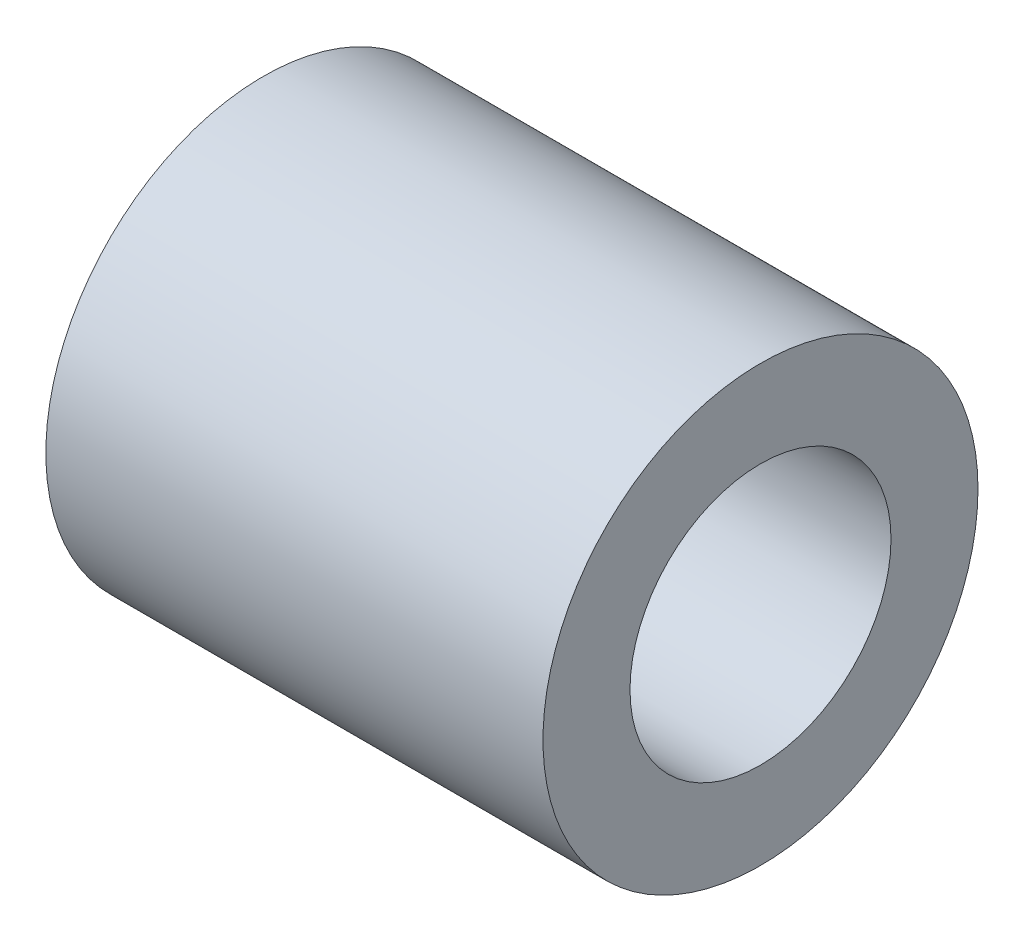
ISO-10303-21;
HEADER;
FILE_DESCRIPTION(('STEP AP214'),'2;1');
FILE_NAME('part.step','',(''),(''),'','','');
FILE_SCHEMA(('AUTOMOTIVE_DESIGN { 1 0 10303 214 1 1 1 1 }'));
ENDSEC;
DATA;
#1=APPLICATION_CONTEXT('core data for automotive mechanical design processes');
#2=APPLICATION_PROTOCOL_DEFINITION('international standard','automotive_design',2000,#1);
#3=PRODUCT_CONTEXT('',#1,'mechanical');
#4=PRODUCT('Part','Part','',(#3));
#5=PRODUCT_RELATED_PRODUCT_CATEGORY('part','',(#4));
#6=PRODUCT_DEFINITION_FORMATION('','',#4);
#7=PRODUCT_DEFINITION_CONTEXT('part definition',#1,'design');
#8=PRODUCT_DEFINITION('design','',#6,#7);
#9=PRODUCT_DEFINITION_SHAPE('','',#8);
#10=(LENGTH_UNIT() NAMED_UNIT(*) SI_UNIT(.MILLI.,.METRE.));
#11=(NAMED_UNIT(*) PLANE_ANGLE_UNIT() SI_UNIT($,.RADIAN.));
#12=(NAMED_UNIT(*) SI_UNIT($,.STERADIAN.) SOLID_ANGLE_UNIT());
#13=UNCERTAINTY_MEASURE_WITH_UNIT(LENGTH_MEASURE(1.E-05),#10,'distance_accuracy_value','');
#14=(GEOMETRIC_REPRESENTATION_CONTEXT(3) GLOBAL_UNCERTAINTY_ASSIGNED_CONTEXT((#13)) GLOBAL_UNIT_ASSIGNED_CONTEXT((#10,
#11,#12)) REPRESENTATION_CONTEXT('',''));
#15=CARTESIAN_POINT('',(0.,0.,0.));
#16=DIRECTION('',(0.,0.,1.));
#17=DIRECTION('',(1.,0.,0.));
#18=AXIS2_PLACEMENT_3D('',#15,#16,#17);
#19=CARTESIAN_POINT('',(4.,0.,0.));
#20=DIRECTION('',(1.,0.,0.));
#21=DIRECTION('',(0.,0.,-1.));
#22=AXIS2_PLACEMENT_3D('',#19,#20,#21);
#23=PLANE('',#22);
#24=CARTESIAN_POINT('',(4.,0.,0.));
#25=DIRECTION('',(1.,0.,0.));
#26=DIRECTION('',(0.,0.,-1.));
#27=AXIS2_PLACEMENT_3D('',#24,#25,#26);
#28=CIRCLE('',#27,3.5);
#29=CARTESIAN_POINT('',(4.,0.,-3.5));
#30=VERTEX_POINT('',#29);
#31=EDGE_CURVE('E10',#30,#30,#28,.T.);
#32=ORIENTED_EDGE('',*,*,#31,.T.);
#33=EDGE_LOOP('',(#32));
#34=FACE_BOUND('',#33,.T.);
#35=CARTESIAN_POINT('',(4.,0.,0.));
#36=DIRECTION('',(1.,0.,0.));
#37=DIRECTION('',(0.,0.,-1.));
#38=AXIS2_PLACEMENT_3D('',#35,#36,#37);
#39=CIRCLE('',#38,2.1);
#40=CARTESIAN_POINT('',(4.,0.,-2.1));
#41=VERTEX_POINT('',#40);
#42=EDGE_CURVE('E41',#41,#41,#39,.T.);
#43=ORIENTED_EDGE('',*,*,#42,.F.);
#44=EDGE_LOOP('',(#43));
#45=FACE_BOUND('',#44,.T.);
#46=ADVANCED_FACE('F30',(#34,#45),#23,.T.);
#47=CARTESIAN_POINT('',(-4.,0.,0.));
#48=DIRECTION('',(1.,0.,0.));
#49=DIRECTION('',(0.,0.,-1.));
#50=AXIS2_PLACEMENT_3D('',#47,#48,#49);
#51=PLANE('',#50);
#52=CARTESIAN_POINT('',(-4.,0.,0.));
#53=DIRECTION('',(1.,0.,0.));
#54=DIRECTION('',(0.,0.,-1.));
#55=AXIS2_PLACEMENT_3D('',#52,#53,#54);
#56=CIRCLE('',#55,3.5);
#57=CARTESIAN_POINT('',(-4.,0.,-3.5));
#58=VERTEX_POINT('',#57);
#59=EDGE_CURVE('E34',#58,#58,#56,.T.);
#60=ORIENTED_EDGE('',*,*,#59,.F.);
#61=EDGE_LOOP('',(#60));
#62=FACE_BOUND('',#61,.T.);
#63=CARTESIAN_POINT('',(-4.,0.,0.));
#64=DIRECTION('',(1.,0.,0.));
#65=DIRECTION('',(0.,0.,-1.));
#66=AXIS2_PLACEMENT_3D('',#63,#64,#65);
#67=CIRCLE('',#66,2.1);
#68=CARTESIAN_POINT('',(-4.,0.,-2.1));
#69=VERTEX_POINT('',#68);
#70=EDGE_CURVE('E43',#69,#69,#67,.T.);
#71=ORIENTED_EDGE('',*,*,#70,.T.);
#72=EDGE_LOOP('',(#71));
#73=FACE_BOUND('',#72,.T.);
#74=ADVANCED_FACE('F53',(#62,#73),#51,.F.);
#75=CARTESIAN_POINT('',(4.,0.,0.));
#76=DIRECTION('',(-1.,0.,0.));
#77=DIRECTION('',(0.,0.,1.));
#78=AXIS2_PLACEMENT_3D('',#75,#76,#77);
#79=CYLINDRICAL_SURFACE('',#78,3.5);
#80=ORIENTED_EDGE('',*,*,#31,.F.);
#81=EDGE_LOOP('',(#80));
#82=FACE_BOUND('',#81,.T.);
#83=ORIENTED_EDGE('',*,*,#59,.T.);
#84=EDGE_LOOP('',(#83));
#85=FACE_BOUND('',#84,.T.);
#86=ADVANCED_FACE('F32',(#82,#85),#79,.T.);
#87=CARTESIAN_POINT('',(4.,0.,0.));
#88=DIRECTION('',(-1.,0.,0.));
#89=DIRECTION('',(0.,0.,1.));
#90=AXIS2_PLACEMENT_3D('',#87,#88,#89);
#91=CYLINDRICAL_SURFACE('',#90,2.1);
#92=ORIENTED_EDGE('',*,*,#42,.T.);
#93=EDGE_LOOP('',(#92));
#94=FACE_BOUND('',#93,.T.);
#95=ORIENTED_EDGE('',*,*,#70,.F.);
#96=EDGE_LOOP('',(#95));
#97=FACE_BOUND('',#96,.T.);
#98=ADVANCED_FACE('F49',(#94,#97),#91,.F.);
#99=CLOSED_SHELL('',(#46,#74,#86,#98));
#100=MANIFOLD_SOLID_BREP('B2',#99);
#101=ADVANCED_BREP_SHAPE_REPRESENTATION('',(#18,#100),#14);
#102=SHAPE_DEFINITION_REPRESENTATION(#9,#101);
ENDSEC;
END-ISO-10303-21;
